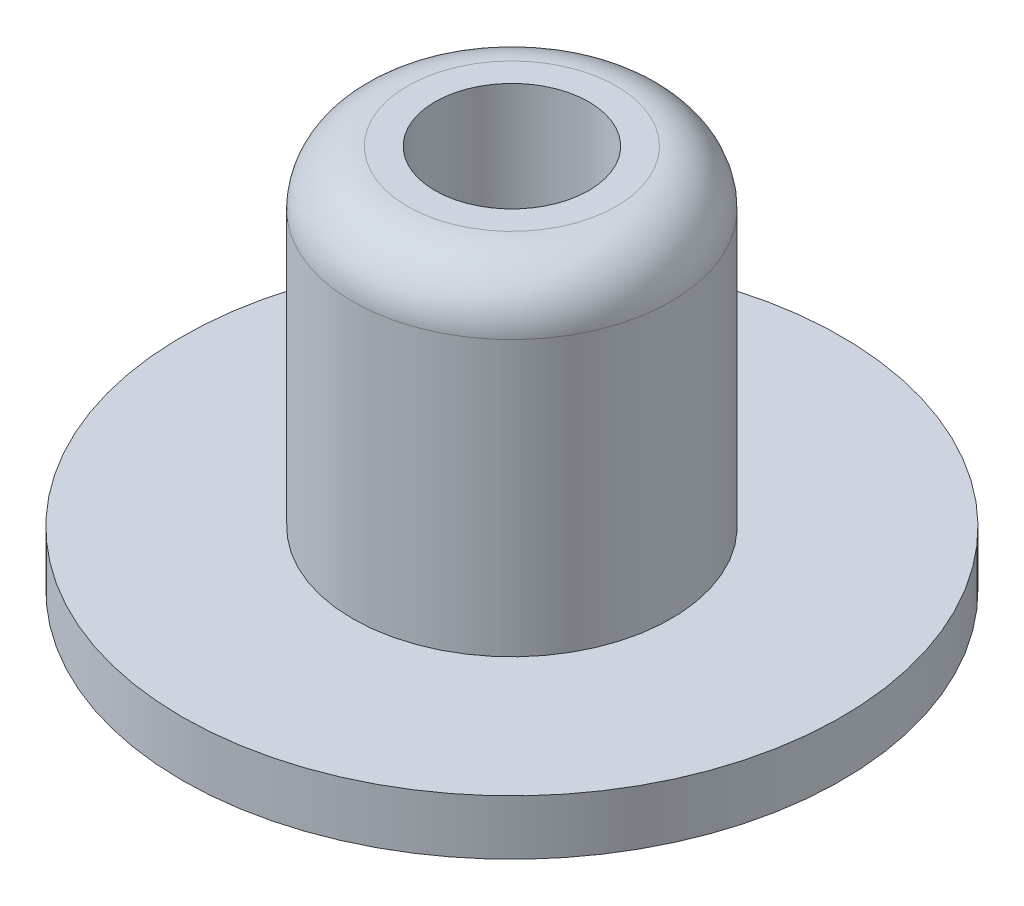
ISO-10303-21;
HEADER;
FILE_DESCRIPTION(('STEP AP214'),'2;1');
FILE_NAME('part.step','',(''),(''),'','','');
FILE_SCHEMA(('AUTOMOTIVE_DESIGN { 1 0 10303 214 1 1 1 1 }'));
ENDSEC;
DATA;
#1=APPLICATION_CONTEXT('core data for automotive mechanical design processes');
#2=APPLICATION_PROTOCOL_DEFINITION('international standard','automotive_design',2000,#1);
#3=PRODUCT_CONTEXT('',#1,'mechanical');
#4=PRODUCT('Part','Part','',(#3));
#5=PRODUCT_RELATED_PRODUCT_CATEGORY('part','',(#4));
#6=PRODUCT_DEFINITION_FORMATION('','',#4);
#7=PRODUCT_DEFINITION_CONTEXT('part definition',#1,'design');
#8=PRODUCT_DEFINITION('design','',#6,#7);
#9=PRODUCT_DEFINITION_SHAPE('','',#8);
#10=(LENGTH_UNIT() NAMED_UNIT(*) SI_UNIT(.MILLI.,.METRE.));
#11=(NAMED_UNIT(*) PLANE_ANGLE_UNIT() SI_UNIT($,.RADIAN.));
#12=(NAMED_UNIT(*) SI_UNIT($,.STERADIAN.) SOLID_ANGLE_UNIT());
#13=UNCERTAINTY_MEASURE_WITH_UNIT(LENGTH_MEASURE(1.E-05),#10,'distance_accuracy_value','');
#14=(GEOMETRIC_REPRESENTATION_CONTEXT(3) GLOBAL_UNCERTAINTY_ASSIGNED_CONTEXT((#13)) GLOBAL_UNIT_ASSIGNED_CONTEXT((#10,
#11,#12)) REPRESENTATION_CONTEXT('',''));
#15=CARTESIAN_POINT('',(0.,0.,0.));
#16=DIRECTION('',(0.,0.,1.));
#17=DIRECTION('',(1.,0.,0.));
#18=AXIS2_PLACEMENT_3D('',#15,#16,#17);
#19=CARTESIAN_POINT('',(0.,15.,0.));
#20=DIRECTION('',(0.,1.,0.));
#21=DIRECTION('',(0.,0.,1.));
#22=AXIS2_PLACEMENT_3D('',#19,#20,#21);
#23=PLANE('',#22);
#24=CARTESIAN_POINT('',(0.,15.,0.));
#25=DIRECTION('',(0.,1.,0.));
#26=DIRECTION('',(0.,0.,1.));
#27=AXIS2_PLACEMENT_3D('',#24,#25,#26);
#28=CIRCLE('',#27,4.75);
#29=CARTESIAN_POINT('',(0.,15.,4.75));
#30=VERTEX_POINT('',#29);
#31=EDGE_CURVE('E50',#30,#30,#28,.T.);
#32=ORIENTED_EDGE('',*,*,#31,.T.);
#33=EDGE_LOOP('',(#32));
#34=FACE_BOUND('',#33,.T.);
#35=CARTESIAN_POINT('',(0.,15.,0.));
#36=DIRECTION('',(0.,1.,0.));
#37=DIRECTION('',(0.,0.,1.));
#38=AXIS2_PLACEMENT_3D('',#35,#36,#37);
#39=CIRCLE('',#38,3.5);
#40=CARTESIAN_POINT('',(0.,15.,3.5));
#41=VERTEX_POINT('',#40);
#42=EDGE_CURVE('E58',#41,#41,#39,.T.);
#43=ORIENTED_EDGE('',*,*,#42,.F.);
#44=EDGE_LOOP('',(#43));
#45=FACE_BOUND('',#44,.T.);
#46=ADVANCED_FACE('F35',(#34,#45),#23,.T.);
#47=CARTESIAN_POINT('',(0.,15.,0.));
#48=DIRECTION('',(0.,-1.,0.));
#49=DIRECTION('',(0.,0.,-1.));
#50=AXIS2_PLACEMENT_3D('',#47,#48,#49);
#51=CYLINDRICAL_SURFACE('',#50,7.25);
#52=CARTESIAN_POINT('',(0.,12.5,0.));
#53=DIRECTION('',(0.,1.,0.));
#54=DIRECTION('',(0.,0.,1.));
#55=AXIS2_PLACEMENT_3D('',#52,#53,#54);
#56=CIRCLE('',#55,7.25);
#57=CARTESIAN_POINT('',(0.,12.5,7.25));
#58=VERTEX_POINT('',#57);
#59=EDGE_CURVE('E46',#58,#58,#56,.F.);
#60=ORIENTED_EDGE('',*,*,#59,.T.);
#61=EDGE_LOOP('',(#60));
#62=FACE_BOUND('',#61,.T.);
#63=CARTESIAN_POINT('',(0.,0.,0.));
#64=DIRECTION('',(0.,1.,0.));
#65=DIRECTION('',(0.,0.,1.));
#66=AXIS2_PLACEMENT_3D('',#63,#64,#65);
#67=CIRCLE('',#66,7.25);
#68=CARTESIAN_POINT('',(0.,0.,7.25));
#69=VERTEX_POINT('',#68);
#70=EDGE_CURVE('E59',#69,#69,#67,.T.);
#71=ORIENTED_EDGE('',*,*,#70,.T.);
#72=EDGE_LOOP('',(#71));
#73=FACE_BOUND('',#72,.T.);
#74=ADVANCED_FACE('F92',(#62,#73),#51,.T.);
#75=CARTESIAN_POINT('',(0.,15.,0.));
#76=DIRECTION('',(0.,-1.,0.));
#77=DIRECTION('',(0.,0.,-1.));
#78=AXIS2_PLACEMENT_3D('',#75,#76,#77);
#79=CYLINDRICAL_SURFACE('',#78,3.5);
#80=CARTESIAN_POINT('',(0.,-2.5,0.));
#81=DIRECTION('',(0.,-1.,0.));
#82=DIRECTION('',(0.,0.,-1.));
#83=AXIS2_PLACEMENT_3D('',#80,#81,#82);
#84=CIRCLE('',#83,3.5);
#85=CARTESIAN_POINT('',(0.,-2.5,-3.5));
#86=VERTEX_POINT('',#85);
#87=EDGE_CURVE('E42',#86,#86,#84,.T.);
#88=ORIENTED_EDGE('',*,*,#87,.T.);
#89=EDGE_LOOP('',(#88));
#90=FACE_BOUND('',#89,.T.);
#91=ORIENTED_EDGE('',*,*,#42,.T.);
#92=EDGE_LOOP('',(#91));
#93=FACE_BOUND('',#92,.T.);
#94=ADVANCED_FACE('F98',(#90,#93),#79,.F.);
#95=CARTESIAN_POINT('',(0.,-5.,0.));
#96=DIRECTION('',(0.,-1.,0.));
#97=DIRECTION('',(0.,0.,-1.));
#98=AXIS2_PLACEMENT_3D('',#95,#96,#97);
#99=PLANE('',#98);
#100=CARTESIAN_POINT('',(0.,-5.,0.));
#101=DIRECTION('',(0.,-1.,0.));
#102=DIRECTION('',(0.,0.,-1.));
#103=AXIS2_PLACEMENT_3D('',#100,#101,#102);
#104=CIRCLE('',#103,6.);
#105=CARTESIAN_POINT('',(0.,-5.,-6.));
#106=VERTEX_POINT('',#105);
#107=EDGE_CURVE('E10',#106,#106,#104,.F.);
#108=ORIENTED_EDGE('',*,*,#107,.T.);
#109=EDGE_LOOP('',(#108));
#110=FACE_BOUND('',#109,.T.);
#111=CARTESIAN_POINT('',(0.,-5.,0.));
#112=DIRECTION('',(0.,-1.,0.));
#113=DIRECTION('',(0.,0.,-1.));
#114=AXIS2_PLACEMENT_3D('',#111,#112,#113);
#115=CIRCLE('',#114,10.);
#116=CARTESIAN_POINT('',(0.,-5.,-10.));
#117=VERTEX_POINT('',#116);
#118=EDGE_CURVE('E62',#117,#117,#115,.T.);
#119=ORIENTED_EDGE('',*,*,#118,.T.);
#120=EDGE_LOOP('',(#119));
#121=FACE_BOUND('',#120,.T.);
#122=ADVANCED_FACE('F118',(#110,#121),#99,.T.);
#123=CARTESIAN_POINT('',(0.,0.,0.));
#124=DIRECTION('',(0.,-1.,0.));
#125=DIRECTION('',(0.,0.,-1.));
#126=AXIS2_PLACEMENT_3D('',#123,#124,#125);
#127=PLANE('',#126);
#128=ORIENTED_EDGE('',*,*,#70,.F.);
#129=EDGE_LOOP('',(#128));
#130=FACE_BOUND('',#129,.T.);
#131=CARTESIAN_POINT('',(0.,0.,0.));
#132=DIRECTION('',(0.,1.,0.));
#133=DIRECTION('',(0.,0.,1.));
#134=AXIS2_PLACEMENT_3D('',#131,#132,#133);
#135=CIRCLE('',#134,15.);
#136=CARTESIAN_POINT('',(0.,0.,15.));
#137=VERTEX_POINT('',#136);
#138=EDGE_CURVE('E68',#137,#137,#135,.T.);
#139=ORIENTED_EDGE('',*,*,#138,.T.);
#140=EDGE_LOOP('',(#139));
#141=FACE_BOUND('',#140,.T.);
#142=ADVANCED_FACE('F89',(#130,#141),#127,.F.);
#143=CARTESIAN_POINT('',(0.,-2.5,0.));
#144=DIRECTION('',(0.,1.,0.));
#145=DIRECTION('',(0.,0.,1.));
#146=AXIS2_PLACEMENT_3D('',#143,#144,#145);
#147=CYLINDRICAL_SURFACE('',#146,15.);
#148=CARTESIAN_POINT('',(0.,-2.5,0.));
#149=DIRECTION('',(0.,1.,0.));
#150=DIRECTION('',(0.,0.,1.));
#151=AXIS2_PLACEMENT_3D('',#148,#149,#150);
#152=CIRCLE('',#151,15.);
#153=CARTESIAN_POINT('',(0.,-2.5,15.));
#154=VERTEX_POINT('',#153);
#155=EDGE_CURVE('E67',#154,#154,#152,.T.);
#156=ORIENTED_EDGE('',*,*,#155,.T.);
#157=EDGE_LOOP('',(#156));
#158=FACE_BOUND('',#157,.T.);
#159=ORIENTED_EDGE('',*,*,#138,.F.);
#160=EDGE_LOOP('',(#159));
#161=FACE_BOUND('',#160,.T.);
#162=ADVANCED_FACE('F74',(#158,#161),#147,.T.);
#163=CARTESIAN_POINT('',(0.,-2.5,0.));
#164=DIRECTION('',(0.,1.,0.));
#165=DIRECTION('',(0.,0.,1.));
#166=AXIS2_PLACEMENT_3D('',#163,#164,#165);
#167=PLANE('',#166);
#168=CARTESIAN_POINT('',(0.,-2.5,0.));
#169=DIRECTION('',(0.,1.,0.));
#170=DIRECTION('',(0.,0.,1.));
#171=AXIS2_PLACEMENT_3D('',#168,#169,#170);
#172=CIRCLE('',#171,14.3301270189222);
#173=CARTESIAN_POINT('',(0.,-2.5,14.3301270189222));
#174=VERTEX_POINT('',#173);
#175=EDGE_CURVE('E55',#174,#174,#172,.T.);
#176=ORIENTED_EDGE('',*,*,#175,.T.);
#177=EDGE_LOOP('',(#176));
#178=FACE_BOUND('',#177,.T.);
#179=ORIENTED_EDGE('',*,*,#155,.F.);
#180=EDGE_LOOP('',(#179));
#181=FACE_BOUND('',#180,.T.);
#182=ADVANCED_FACE('F77',(#178,#181),#167,.F.);
#183=CARTESIAN_POINT('',(0.,-7.5,0.));
#184=DIRECTION('',(0.,1.,0.));
#185=DIRECTION('',(0.,0.,1.));
#186=AXIS2_PLACEMENT_3D('',#183,#184,#185);
#187=TOROIDAL_SURFACE('',#186,14.3301270189222,5.);
#188=ORIENTED_EDGE('',*,*,#118,.F.);
#189=EDGE_LOOP('',(#188));
#190=FACE_BOUND('',#189,.T.);
#191=ORIENTED_EDGE('',*,*,#175,.F.);
#192=EDGE_LOOP('',(#191));
#193=FACE_BOUND('',#192,.T.);
#194=ADVANCED_FACE('F79',(#190,#193),#187,.F.);
#195=CARTESIAN_POINT('',(0.,12.5,0.));
#196=DIRECTION('',(0.,1.,0.));
#197=DIRECTION('',(0.,0.,1.));
#198=AXIS2_PLACEMENT_3D('',#195,#196,#197);
#199=TOROIDAL_SURFACE('',#198,4.75,2.5);
#200=ORIENTED_EDGE('',*,*,#59,.F.);
#201=EDGE_LOOP('',(#200));
#202=FACE_BOUND('',#201,.T.);
#203=ORIENTED_EDGE('',*,*,#31,.F.);
#204=EDGE_LOOP('',(#203));
#205=FACE_BOUND('',#204,.T.);
#206=ADVANCED_FACE('F86',(#202,#205),#199,.T.);
#207=CARTESIAN_POINT('',(0.,-2.5,0.));
#208=DIRECTION('',(0.,-1.,0.));
#209=DIRECTION('',(0.,0.,-1.));
#210=AXIS2_PLACEMENT_3D('',#207,#208,#209);
#211=TOROIDAL_SURFACE('',#210,6.,2.5);
#212=ORIENTED_EDGE('',*,*,#107,.F.);
#213=EDGE_LOOP('',(#212));
#214=FACE_BOUND('',#213,.T.);
#215=ORIENTED_EDGE('',*,*,#87,.F.);
#216=EDGE_LOOP('',(#215));
#217=FACE_BOUND('',#216,.T.);
#218=ADVANCED_FACE('F37',(#214,#217),#211,.T.);
#219=CLOSED_SHELL('',(#46,#74,#94,#122,#142,#162,#182,#194,#206,#218));
#220=MANIFOLD_SOLID_BREP('B2',#219);
#221=ADVANCED_BREP_SHAPE_REPRESENTATION('',(#18,#220),#14);
#222=SHAPE_DEFINITION_REPRESENTATION(#9,#221);
ENDSEC;
END-ISO-10303-21;
